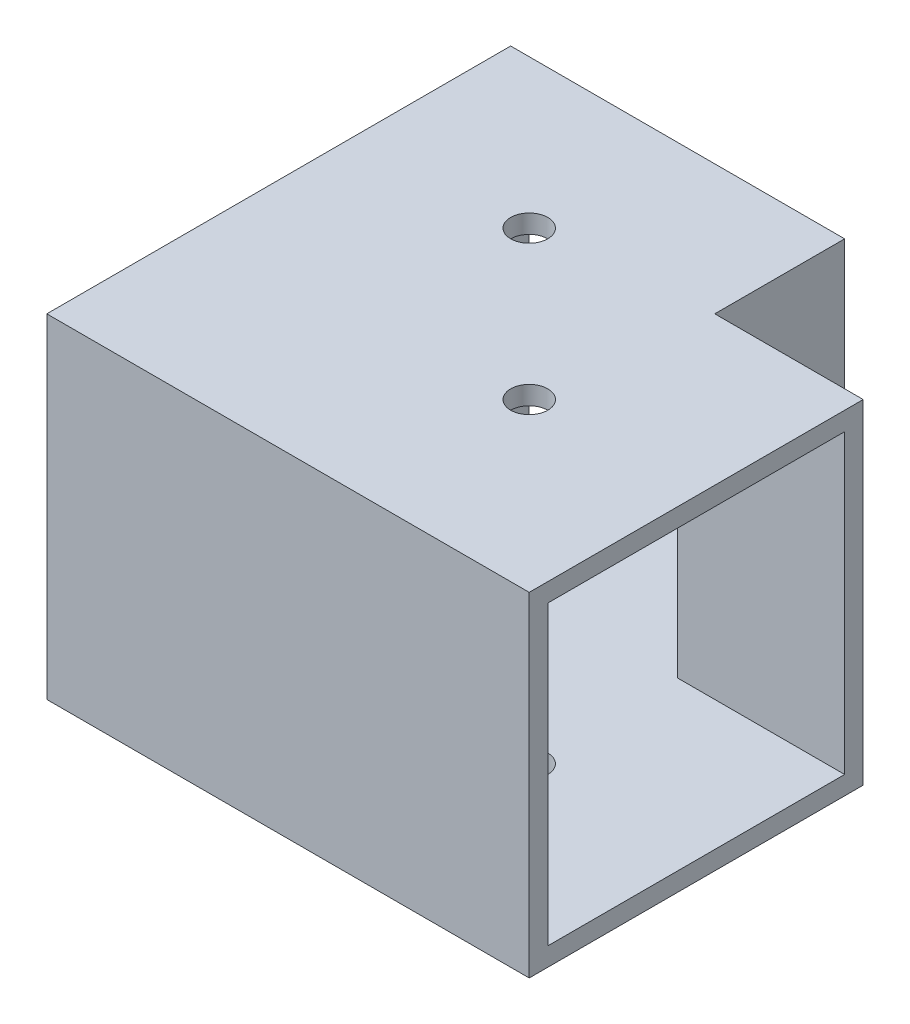
ISO-10303-21;
HEADER;
FILE_DESCRIPTION(('STEP AP214'),'2;1');
FILE_NAME('part.step','',(''),(''),'','','');
FILE_SCHEMA(('AUTOMOTIVE_DESIGN { 1 0 10303 214 1 1 1 1 }'));
ENDSEC;
DATA;
#1=APPLICATION_CONTEXT('core data for automotive mechanical design processes');
#2=APPLICATION_PROTOCOL_DEFINITION('international standard','automotive_design',2000,#1);
#3=PRODUCT_CONTEXT('',#1,'mechanical');
#4=PRODUCT('Part','Part','',(#3));
#5=PRODUCT_RELATED_PRODUCT_CATEGORY('part','',(#4));
#6=PRODUCT_DEFINITION_FORMATION('','',#4);
#7=PRODUCT_DEFINITION_CONTEXT('part definition',#1,'design');
#8=PRODUCT_DEFINITION('design','',#6,#7);
#9=PRODUCT_DEFINITION_SHAPE('','',#8);
#10=(LENGTH_UNIT() NAMED_UNIT(*) SI_UNIT(.MILLI.,.METRE.));
#11=(NAMED_UNIT(*) PLANE_ANGLE_UNIT() SI_UNIT($,.RADIAN.));
#12=(NAMED_UNIT(*) SI_UNIT($,.STERADIAN.) SOLID_ANGLE_UNIT());
#13=UNCERTAINTY_MEASURE_WITH_UNIT(LENGTH_MEASURE(1.E-05),#10,'distance_accuracy_value','');
#14=(GEOMETRIC_REPRESENTATION_CONTEXT(3) GLOBAL_UNCERTAINTY_ASSIGNED_CONTEXT((#13)) GLOBAL_UNIT_ASSIGNED_CONTEXT((#10,
#11,#12)) REPRESENTATION_CONTEXT('',''));
#15=CARTESIAN_POINT('',(0.,0.,0.));
#16=DIRECTION('',(0.,0.,1.));
#17=DIRECTION('',(1.,0.,0.));
#18=AXIS2_PLACEMENT_3D('',#15,#16,#17);
#19=CARTESIAN_POINT('',(-50.8,50.8,50.8));
#20=DIRECTION('',(0.,-1.,0.));
#21=DIRECTION('',(0.,0.,-1.));
#22=AXIS2_PLACEMENT_3D('',#19,#20,#21);
#23=PLANE('',#22);
#24=CARTESIAN_POINT('',(50.8,50.8,101.6));
#25=DIRECTION('',(0.,-1.,0.));
#26=DIRECTION('',(0.,0.,-1.));
#27=AXIS2_PLACEMENT_3D('',#24,#25,#26);
#28=CIRCLE('',#27,6.35);
#29=CARTESIAN_POINT('',(50.8,50.8,107.95));
#30=VERTEX_POINT('',#29);
#31=EDGE_CURVE('E590',#30,#30,#28,.F.);
#32=ORIENTED_EDGE('',*,*,#31,.T.);
#33=EDGE_LOOP('',(#32));
#34=FACE_BOUND('',#33,.T.);
#35=CARTESIAN_POINT('',(0.,50.8,50.8));
#36=DIRECTION('',(0.,-1.,0.));
#37=DIRECTION('',(0.,0.,-1.));
#38=AXIS2_PLACEMENT_3D('',#35,#36,#37);
#39=CIRCLE('',#38,6.35);
#40=CARTESIAN_POINT('',(0.,50.8,57.15));
#41=VERTEX_POINT('',#40);
#42=EDGE_CURVE('E199',#41,#41,#39,.T.);
#43=ORIENTED_EDGE('',*,*,#42,.F.);
#44=EDGE_LOOP('',(#43));
#45=FACE_BOUND('',#44,.T.);
#46=DIRECTION('',(-1.,0.,0.));
#47=VECTOR('',#46,1.);
#48=CARTESIAN_POINT('',(107.95,50.8,152.4));
#49=LINE('',#48,#47);
#50=CARTESIAN_POINT('',(107.95,50.8,152.4));
#51=VERTEX_POINT('',#50);
#52=CARTESIAN_POINT('',(-50.8,50.8,152.4));
#53=VERTEX_POINT('',#52);
#54=EDGE_CURVE('E206',#51,#53,#49,.T.);
#55=ORIENTED_EDGE('',*,*,#54,.T.);
#56=DIRECTION('',(0.,0.,-1.));
#57=VECTOR('',#56,1.);
#58=CARTESIAN_POINT('',(-50.8,50.8,50.8));
#59=LINE('',#58,#57);
#60=CARTESIAN_POINT('',(-50.8,50.8,0.));
#61=VERTEX_POINT('',#60);
#62=EDGE_CURVE('E107',#53,#61,#59,.T.);
#63=ORIENTED_EDGE('',*,*,#62,.T.);
#64=DIRECTION('',(-1.,0.,0.));
#65=VECTOR('',#64,1.);
#66=CARTESIAN_POINT('',(-50.8,50.8,0.));
#67=LINE('',#66,#65);
#68=CARTESIAN_POINT('',(50.8,50.8,0.));
#69=VERTEX_POINT('',#68);
#70=EDGE_CURVE('E258',#69,#61,#67,.T.);
#71=ORIENTED_EDGE('',*,*,#70,.F.);
#72=DIRECTION('',(0.,0.,-1.));
#73=VECTOR('',#72,1.);
#74=CARTESIAN_POINT('',(50.8,50.8,50.8));
#75=LINE('',#74,#73);
#76=CARTESIAN_POINT('',(50.8,50.8,50.8));
#77=VERTEX_POINT('',#76);
#78=EDGE_CURVE('E271',#77,#69,#75,.T.);
#79=ORIENTED_EDGE('',*,*,#78,.F.);
#80=DIRECTION('',(-1.,0.,0.));
#81=VECTOR('',#80,1.);
#82=CARTESIAN_POINT('',(107.95,50.8,50.8));
#83=LINE('',#82,#81);
#84=CARTESIAN_POINT('',(107.95,50.8,50.8));
#85=VERTEX_POINT('',#84);
#86=EDGE_CURVE('E211',#85,#77,#83,.T.);
#87=ORIENTED_EDGE('',*,*,#86,.F.);
#88=DIRECTION('',(0.,0.,1.));
#89=VECTOR('',#88,1.);
#90=CARTESIAN_POINT('',(107.95,50.8,50.8));
#91=LINE('',#90,#89);
#92=EDGE_CURVE('E322',#85,#51,#91,.T.);
#93=ORIENTED_EDGE('',*,*,#92,.T.);
#94=EDGE_LOOP('',(#55,#63,#71,#79,#87,#93));
#95=FACE_BOUND('',#94,.T.);
#96=ADVANCED_FACE('F91',(#34,#45,#95),#23,.T.);
#97=CARTESIAN_POINT('',(-50.8,-50.8,50.8));
#98=DIRECTION('',(0.,1.,0.));
#99=DIRECTION('',(0.,0.,1.));
#100=AXIS2_PLACEMENT_3D('',#97,#98,#99);
#101=PLANE('',#100);
#102=CARTESIAN_POINT('',(50.8,-50.8,101.6));
#103=DIRECTION('',(0.,1.,0.));
#104=DIRECTION('',(0.,0.,1.));
#105=AXIS2_PLACEMENT_3D('',#102,#103,#104);
#106=CIRCLE('',#105,6.35);
#107=CARTESIAN_POINT('',(50.8,-50.8,107.95));
#108=VERTEX_POINT('',#107);
#109=EDGE_CURVE('E601',#108,#108,#106,.F.);
#110=ORIENTED_EDGE('',*,*,#109,.T.);
#111=EDGE_LOOP('',(#110));
#112=FACE_BOUND('',#111,.T.);
#113=CARTESIAN_POINT('',(0.,-50.8,50.8));
#114=DIRECTION('',(0.,1.,0.));
#115=DIRECTION('',(0.,0.,1.));
#116=AXIS2_PLACEMENT_3D('',#113,#114,#115);
#117=CIRCLE('',#116,6.35);
#118=CARTESIAN_POINT('',(0.,-50.8,57.15));
#119=VERTEX_POINT('',#118);
#120=EDGE_CURVE('E582',#119,#119,#117,.T.);
#121=ORIENTED_EDGE('',*,*,#120,.F.);
#122=EDGE_LOOP('',(#121));
#123=FACE_BOUND('',#122,.T.);
#124=DIRECTION('',(0.,0.,-1.));
#125=VECTOR('',#124,1.);
#126=CARTESIAN_POINT('',(-50.8,-50.8,50.8));
#127=LINE('',#126,#125);
#128=CARTESIAN_POINT('',(-50.8,-50.8,152.4));
#129=VERTEX_POINT('',#128);
#130=CARTESIAN_POINT('',(-50.8,-50.8,0.));
#131=VERTEX_POINT('',#130);
#132=EDGE_CURVE('E180',#129,#131,#127,.T.);
#133=ORIENTED_EDGE('',*,*,#132,.F.);
#134=DIRECTION('',(-1.,0.,0.));
#135=VECTOR('',#134,1.);
#136=CARTESIAN_POINT('',(107.95,-50.8,152.4));
#137=LINE('',#136,#135);
#138=CARTESIAN_POINT('',(107.95,-50.8,152.4));
#139=VERTEX_POINT('',#138);
#140=EDGE_CURVE('E183',#139,#129,#137,.T.);
#141=ORIENTED_EDGE('',*,*,#140,.F.);
#142=DIRECTION('',(0.,0.,-1.));
#143=VECTOR('',#142,1.);
#144=CARTESIAN_POINT('',(107.95,-50.8,50.8));
#145=LINE('',#144,#143);
#146=CARTESIAN_POINT('',(107.95,-50.8,50.8));
#147=VERTEX_POINT('',#146);
#148=EDGE_CURVE('E213',#139,#147,#145,.T.);
#149=ORIENTED_EDGE('',*,*,#148,.T.);
#150=DIRECTION('',(-1.,0.,0.));
#151=VECTOR('',#150,1.);
#152=CARTESIAN_POINT('',(107.95,-50.8,50.8));
#153=LINE('',#152,#151);
#154=CARTESIAN_POINT('',(50.8,-50.8,50.8));
#155=VERTEX_POINT('',#154);
#156=EDGE_CURVE('E207',#147,#155,#153,.T.);
#157=ORIENTED_EDGE('',*,*,#156,.T.);
#158=DIRECTION('',(0.,0.,-1.));
#159=VECTOR('',#158,1.);
#160=CARTESIAN_POINT('',(50.8,-50.8,50.8));
#161=LINE('',#160,#159);
#162=CARTESIAN_POINT('',(50.8,-50.8,0.));
#163=VERTEX_POINT('',#162);
#164=EDGE_CURVE('E190',#155,#163,#161,.T.);
#165=ORIENTED_EDGE('',*,*,#164,.T.);
#166=DIRECTION('',(1.,0.,0.));
#167=VECTOR('',#166,1.);
#168=CARTESIAN_POINT('',(-50.8,-50.8,0.));
#169=LINE('',#168,#167);
#170=EDGE_CURVE('E187',#131,#163,#169,.T.);
#171=ORIENTED_EDGE('',*,*,#170,.F.);
#172=EDGE_LOOP('',(#133,#141,#149,#157,#165,#171));
#173=FACE_BOUND('',#172,.T.);
#174=ADVANCED_FACE('F181',(#112,#123,#173),#101,.T.);
#175=CARTESIAN_POINT('',(107.95,-50.8,152.4));
#176=DIRECTION('',(0.,0.,-1.));
#177=DIRECTION('',(-1.,0.,0.));
#178=AXIS2_PLACEMENT_3D('',#175,#176,#177);
#179=PLANE('',#178);
#180=ORIENTED_EDGE('',*,*,#140,.T.);
#181=DIRECTION('',(0.,-1.,0.));
#182=VECTOR('',#181,1.);
#183=CARTESIAN_POINT('',(-50.8,-50.8,152.4));
#184=LINE('',#183,#182);
#185=EDGE_CURVE('E192',#53,#129,#184,.T.);
#186=ORIENTED_EDGE('',*,*,#185,.F.);
#187=ORIENTED_EDGE('',*,*,#54,.F.);
#188=DIRECTION('',(0.,-1.,0.));
#189=VECTOR('',#188,1.);
#190=CARTESIAN_POINT('',(107.95,-50.8,152.4));
#191=LINE('',#190,#189);
#192=EDGE_CURVE('E203',#51,#139,#191,.T.);
#193=ORIENTED_EDGE('',*,*,#192,.T.);
#194=EDGE_LOOP('',(#180,#186,#187,#193));
#195=FACE_BOUND('',#194,.T.);
#196=ADVANCED_FACE('F201',(#195),#179,.T.);
#197=CARTESIAN_POINT('',(0.,0.,50.8));
#198=DIRECTION('',(0.,0.,1.));
#199=DIRECTION('',(1.,0.,0.));
#200=AXIS2_PLACEMENT_3D('',#197,#198,#199);
#201=PLANE('',#200);
#202=ORIENTED_EDGE('',*,*,#86,.T.);
#203=DIRECTION('',(0.,1.,0.));
#204=VECTOR('',#203,1.);
#205=CARTESIAN_POINT('',(50.8,-50.8,50.8));
#206=LINE('',#205,#204);
#207=EDGE_CURVE('E251',#155,#77,#206,.T.);
#208=ORIENTED_EDGE('',*,*,#207,.F.);
#209=ORIENTED_EDGE('',*,*,#156,.F.);
#210=DIRECTION('',(0.,1.,0.));
#211=VECTOR('',#210,1.);
#212=CARTESIAN_POINT('',(107.95,-50.8,50.8));
#213=LINE('',#212,#211);
#214=EDGE_CURVE('E319',#147,#85,#213,.T.);
#215=ORIENTED_EDGE('',*,*,#214,.T.);
#216=EDGE_LOOP('',(#202,#208,#209,#215));
#217=FACE_BOUND('',#216,.T.);
#218=ADVANCED_FACE('F336',(#217),#201,.T.);
#219=CARTESIAN_POINT('',(57.15,0.,50.8));
#220=DIRECTION('',(-1.,0.,0.));
#221=DIRECTION('',(0.,0.,1.));
#222=AXIS2_PLACEMENT_3D('',#219,#220,#221);
#223=PLANE('',#222);
#224=DIRECTION('',(0.,1.,0.));
#225=VECTOR('',#224,1.);
#226=CARTESIAN_POINT('',(57.15,-50.8,44.45));
#227=LINE('',#226,#225);
#228=CARTESIAN_POINT('',(57.15,-57.15,44.45));
#229=VERTEX_POINT('',#228);
#230=CARTESIAN_POINT('',(57.15,57.15,44.45));
#231=VERTEX_POINT('',#230);
#232=EDGE_CURVE('E115',#229,#231,#227,.T.);
#233=ORIENTED_EDGE('',*,*,#232,.F.);
#234=DIRECTION('',(0.,0.,-1.));
#235=VECTOR('',#234,1.);
#236=CARTESIAN_POINT('',(57.15,-57.15,50.8));
#237=LINE('',#236,#235);
#238=CARTESIAN_POINT('',(57.15,-57.15,0.));
#239=VERTEX_POINT('',#238);
#240=EDGE_CURVE('E289',#229,#239,#237,.T.);
#241=ORIENTED_EDGE('',*,*,#240,.T.);
#242=DIRECTION('',(0.,1.,0.));
#243=VECTOR('',#242,1.);
#244=CARTESIAN_POINT('',(57.15,0.,0.));
#245=LINE('',#244,#243);
#246=CARTESIAN_POINT('',(57.15,57.15,0.));
#247=VERTEX_POINT('',#246);
#248=EDGE_CURVE('E275',#239,#247,#245,.T.);
#249=ORIENTED_EDGE('',*,*,#248,.T.);
#250=DIRECTION('',(0.,0.,-1.));
#251=VECTOR('',#250,1.);
#252=CARTESIAN_POINT('',(57.15,57.15,50.8));
#253=LINE('',#252,#251);
#254=EDGE_CURVE('E12',#231,#247,#253,.T.);
#255=ORIENTED_EDGE('',*,*,#254,.F.);
#256=EDGE_LOOP('',(#233,#241,#249,#255));
#257=FACE_BOUND('',#256,.T.);
#258=ADVANCED_FACE('F93',(#257),#223,.F.);
#259=CARTESIAN_POINT('',(0.,0.,0.));
#260=DIRECTION('',(0.,0.,1.));
#261=DIRECTION('',(1.,0.,0.));
#262=AXIS2_PLACEMENT_3D('',#259,#260,#261);
#263=PLANE('',#262);
#264=ORIENTED_EDGE('',*,*,#248,.F.);
#265=DIRECTION('',(1.,0.,0.));
#266=VECTOR('',#265,1.);
#267=CARTESIAN_POINT('',(0.,-57.15,0.));
#268=LINE('',#267,#266);
#269=CARTESIAN_POINT('',(-57.15,-57.15,0.));
#270=VERTEX_POINT('',#269);
#271=EDGE_CURVE('E285',#270,#239,#268,.T.);
#272=ORIENTED_EDGE('',*,*,#271,.F.);
#273=DIRECTION('',(0.,-1.,0.));
#274=VECTOR('',#273,1.);
#275=CARTESIAN_POINT('',(-57.15,0.,0.));
#276=LINE('',#275,#274);
#277=CARTESIAN_POINT('',(-57.15,57.15,0.));
#278=VERTEX_POINT('',#277);
#279=EDGE_CURVE('E282',#278,#270,#276,.T.);
#280=ORIENTED_EDGE('',*,*,#279,.F.);
#281=DIRECTION('',(-1.,0.,0.));
#282=VECTOR('',#281,1.);
#283=CARTESIAN_POINT('',(0.,57.15,0.));
#284=LINE('',#283,#282);
#285=EDGE_CURVE('E279',#247,#278,#284,.T.);
#286=ORIENTED_EDGE('',*,*,#285,.F.);
#287=EDGE_LOOP('',(#264,#272,#280,#286));
#288=FACE_BOUND('',#287,.T.);
#289=DIRECTION('',(0.,1.,0.));
#290=VECTOR('',#289,1.);
#291=CARTESIAN_POINT('',(50.8,-50.8,0.));
#292=LINE('',#291,#290);
#293=EDGE_CURVE('E250',#163,#69,#292,.T.);
#294=ORIENTED_EDGE('',*,*,#293,.T.);
#295=ORIENTED_EDGE('',*,*,#70,.T.);
#296=DIRECTION('',(0.,-1.,0.));
#297=VECTOR('',#296,1.);
#298=CARTESIAN_POINT('',(-50.8,-50.8,0.));
#299=LINE('',#298,#297);
#300=EDGE_CURVE('E262',#61,#131,#299,.T.);
#301=ORIENTED_EDGE('',*,*,#300,.T.);
#302=ORIENTED_EDGE('',*,*,#170,.T.);
#303=EDGE_LOOP('',(#294,#295,#301,#302));
#304=FACE_BOUND('',#303,.T.);
#305=ADVANCED_FACE('F308',(#288,#304),#263,.F.);
#306=CARTESIAN_POINT('',(0.,57.15,50.8));
#307=DIRECTION('',(0.,-1.,0.));
#308=DIRECTION('',(0.,0.,-1.));
#309=AXIS2_PLACEMENT_3D('',#306,#307,#308);
#310=PLANE('',#309);
#311=CARTESIAN_POINT('',(50.8,57.15,101.6));
#312=DIRECTION('',(0.,-1.,0.));
#313=DIRECTION('',(-1.,0.,0.));
#314=AXIS2_PLACEMENT_3D('',#311,#312,#313);
#315=CIRCLE('',#314,6.35);
#316=CARTESIAN_POINT('',(50.8,57.15,107.95));
#317=VERTEX_POINT('',#316);
#318=EDGE_CURVE('E605',#317,#317,#315,.T.);
#319=ORIENTED_EDGE('',*,*,#318,.T.);
#320=EDGE_LOOP('',(#319));
#321=FACE_BOUND('',#320,.T.);
#322=CARTESIAN_POINT('',(0.,57.15,50.8));
#323=DIRECTION('',(0.,1.,0.));
#324=DIRECTION('',(0.,0.,1.));
#325=AXIS2_PLACEMENT_3D('',#322,#323,#324);
#326=CIRCLE('',#325,6.35);
#327=CARTESIAN_POINT('',(0.,57.15,57.15));
#328=VERTEX_POINT('',#327);
#329=EDGE_CURVE('E583',#328,#328,#326,.T.);
#330=ORIENTED_EDGE('',*,*,#329,.F.);
#331=EDGE_LOOP('',(#330));
#332=FACE_BOUND('',#331,.T.);
#333=DIRECTION('',(0.,0.,-1.));
#334=VECTOR('',#333,1.);
#335=CARTESIAN_POINT('',(-57.15,57.15,50.8));
#336=LINE('',#335,#334);
#337=CARTESIAN_POINT('',(-57.15,57.15,158.75));
#338=VERTEX_POINT('',#337);
#339=EDGE_CURVE('E100',#338,#278,#336,.T.);
#340=ORIENTED_EDGE('',*,*,#339,.F.);
#341=DIRECTION('',(-1.,0.,0.));
#342=VECTOR('',#341,1.);
#343=CARTESIAN_POINT('',(107.95,57.15,158.75));
#344=LINE('',#343,#342);
#345=CARTESIAN_POINT('',(107.95,57.15,158.75));
#346=VERTEX_POINT('',#345);
#347=EDGE_CURVE('E242',#346,#338,#344,.T.);
#348=ORIENTED_EDGE('',*,*,#347,.F.);
#349=DIRECTION('',(0.,0.,1.));
#350=VECTOR('',#349,1.);
#351=CARTESIAN_POINT('',(107.95,57.15,50.8));
#352=LINE('',#351,#350);
#353=CARTESIAN_POINT('',(107.95,57.15,44.45));
#354=VERTEX_POINT('',#353);
#355=EDGE_CURVE('E223',#354,#346,#352,.T.);
#356=ORIENTED_EDGE('',*,*,#355,.F.);
#357=DIRECTION('',(-1.,0.,0.));
#358=VECTOR('',#357,1.);
#359=CARTESIAN_POINT('',(107.95,57.15,44.45));
#360=LINE('',#359,#358);
#361=EDGE_CURVE('E246',#354,#231,#360,.T.);
#362=ORIENTED_EDGE('',*,*,#361,.T.);
#363=ORIENTED_EDGE('',*,*,#254,.T.);
#364=ORIENTED_EDGE('',*,*,#285,.T.);
#365=EDGE_LOOP('',(#340,#348,#356,#362,#363,#364));
#366=FACE_BOUND('',#365,.T.);
#367=ADVANCED_FACE('F345',(#321,#332,#366),#310,.F.);
#368=CARTESIAN_POINT('',(-57.15,0.,50.8));
#369=DIRECTION('',(1.,0.,0.));
#370=DIRECTION('',(0.,0.,-1.));
#371=AXIS2_PLACEMENT_3D('',#368,#369,#370);
#372=PLANE('',#371);
#373=ORIENTED_EDGE('',*,*,#279,.T.);
#374=DIRECTION('',(0.,0.,-1.));
#375=VECTOR('',#374,1.);
#376=CARTESIAN_POINT('',(-57.15,-57.15,50.8));
#377=LINE('',#376,#375);
#378=CARTESIAN_POINT('',(-57.15,-57.15,158.75));
#379=VERTEX_POINT('',#378);
#380=EDGE_CURVE('E292',#379,#270,#377,.T.);
#381=ORIENTED_EDGE('',*,*,#380,.F.);
#382=DIRECTION('',(0.,-1.,0.));
#383=VECTOR('',#382,1.);
#384=CARTESIAN_POINT('',(-57.15,-57.15,158.75));
#385=LINE('',#384,#383);
#386=EDGE_CURVE('E198',#338,#379,#385,.T.);
#387=ORIENTED_EDGE('',*,*,#386,.F.);
#388=ORIENTED_EDGE('',*,*,#339,.T.);
#389=EDGE_LOOP('',(#373,#381,#387,#388));
#390=FACE_BOUND('',#389,.T.);
#391=ADVANCED_FACE('F300',(#390),#372,.F.);
#392=CARTESIAN_POINT('',(0.,-57.15,50.8));
#393=DIRECTION('',(0.,1.,0.));
#394=DIRECTION('',(0.,0.,1.));
#395=AXIS2_PLACEMENT_3D('',#392,#393,#394);
#396=PLANE('',#395);
#397=CARTESIAN_POINT('',(50.8,-57.15,101.6));
#398=DIRECTION('',(0.,-1.,0.));
#399=DIRECTION('',(-1.,0.,0.));
#400=AXIS2_PLACEMENT_3D('',#397,#398,#399);
#401=CIRCLE('',#400,6.35);
#402=CARTESIAN_POINT('',(50.8,-57.15,107.95));
#403=VERTEX_POINT('',#402);
#404=EDGE_CURVE('E576',#403,#403,#401,.T.);
#405=ORIENTED_EDGE('',*,*,#404,.F.);
#406=EDGE_LOOP('',(#405));
#407=FACE_BOUND('',#406,.T.);
#408=CARTESIAN_POINT('',(0.,-57.15,50.8));
#409=DIRECTION('',(0.,1.,0.));
#410=DIRECTION('',(0.,0.,1.));
#411=AXIS2_PLACEMENT_3D('',#408,#409,#410);
#412=CIRCLE('',#411,6.35);
#413=CARTESIAN_POINT('',(0.,-57.15,57.15));
#414=VERTEX_POINT('',#413);
#415=EDGE_CURVE('E579',#414,#414,#412,.T.);
#416=ORIENTED_EDGE('',*,*,#415,.T.);
#417=EDGE_LOOP('',(#416));
#418=FACE_BOUND('',#417,.T.);
#419=ORIENTED_EDGE('',*,*,#271,.T.);
#420=ORIENTED_EDGE('',*,*,#240,.F.);
#421=DIRECTION('',(-1.,0.,0.));
#422=VECTOR('',#421,1.);
#423=CARTESIAN_POINT('',(107.95,-57.15,44.45));
#424=LINE('',#423,#422);
#425=CARTESIAN_POINT('',(107.95,-57.15,44.45));
#426=VERTEX_POINT('',#425);
#427=EDGE_CURVE('E232',#426,#229,#424,.T.);
#428=ORIENTED_EDGE('',*,*,#427,.F.);
#429=DIRECTION('',(0.,0.,-1.));
#430=VECTOR('',#429,1.);
#431=CARTESIAN_POINT('',(107.95,-57.15,50.8));
#432=LINE('',#431,#430);
#433=CARTESIAN_POINT('',(107.95,-57.15,158.75));
#434=VERTEX_POINT('',#433);
#435=EDGE_CURVE('E229',#434,#426,#432,.T.);
#436=ORIENTED_EDGE('',*,*,#435,.F.);
#437=DIRECTION('',(-1.,0.,0.));
#438=VECTOR('',#437,1.);
#439=CARTESIAN_POINT('',(107.95,-57.15,158.75));
#440=LINE('',#439,#438);
#441=EDGE_CURVE('E238',#434,#379,#440,.T.);
#442=ORIENTED_EDGE('',*,*,#441,.T.);
#443=ORIENTED_EDGE('',*,*,#380,.T.);
#444=EDGE_LOOP('',(#419,#420,#428,#436,#442,#443));
#445=FACE_BOUND('',#444,.T.);
#446=ADVANCED_FACE('F311',(#407,#418,#445),#396,.F.);
#447=CARTESIAN_POINT('',(50.8,-50.8,50.8));
#448=DIRECTION('',(-1.,0.,0.));
#449=DIRECTION('',(0.,0.,1.));
#450=AXIS2_PLACEMENT_3D('',#447,#448,#449);
#451=PLANE('',#450);
#452=ORIENTED_EDGE('',*,*,#293,.F.);
#453=ORIENTED_EDGE('',*,*,#164,.F.);
#454=ORIENTED_EDGE('',*,*,#207,.T.);
#455=ORIENTED_EDGE('',*,*,#78,.T.);
#456=EDGE_LOOP('',(#452,#453,#454,#455));
#457=FACE_BOUND('',#456,.T.);
#458=ADVANCED_FACE('F343',(#457),#451,.T.);
#459=CARTESIAN_POINT('',(-50.8,-50.8,50.8));
#460=DIRECTION('',(1.,0.,0.));
#461=DIRECTION('',(0.,0.,-1.));
#462=AXIS2_PLACEMENT_3D('',#459,#460,#461);
#463=PLANE('',#462);
#464=ORIENTED_EDGE('',*,*,#300,.F.);
#465=ORIENTED_EDGE('',*,*,#62,.F.);
#466=ORIENTED_EDGE('',*,*,#185,.T.);
#467=ORIENTED_EDGE('',*,*,#132,.T.);
#468=EDGE_LOOP('',(#464,#465,#466,#467));
#469=FACE_BOUND('',#468,.T.);
#470=ADVANCED_FACE('F193',(#469),#463,.T.);
#471=CARTESIAN_POINT('',(107.95,0.,0.));
#472=DIRECTION('',(1.,0.,0.));
#473=DIRECTION('',(0.,0.,-1.));
#474=AXIS2_PLACEMENT_3D('',#471,#472,#473);
#475=PLANE('',#474);
#476=DIRECTION('',(0.,1.,0.));
#477=VECTOR('',#476,1.);
#478=CARTESIAN_POINT('',(107.95,-50.8,44.45));
#479=LINE('',#478,#477);
#480=EDGE_CURVE('E219',#426,#354,#479,.T.);
#481=ORIENTED_EDGE('',*,*,#480,.T.);
#482=ORIENTED_EDGE('',*,*,#355,.T.);
#483=DIRECTION('',(0.,-1.,0.));
#484=VECTOR('',#483,1.);
#485=CARTESIAN_POINT('',(107.95,-50.8,158.75));
#486=LINE('',#485,#484);
#487=EDGE_CURVE('E226',#346,#434,#486,.T.);
#488=ORIENTED_EDGE('',*,*,#487,.T.);
#489=ORIENTED_EDGE('',*,*,#435,.T.);
#490=EDGE_LOOP('',(#481,#482,#488,#489));
#491=FACE_BOUND('',#490,.T.);
#492=ORIENTED_EDGE('',*,*,#92,.F.);
#493=ORIENTED_EDGE('',*,*,#214,.F.);
#494=ORIENTED_EDGE('',*,*,#148,.F.);
#495=ORIENTED_EDGE('',*,*,#192,.F.);
#496=EDGE_LOOP('',(#492,#493,#494,#495));
#497=FACE_BOUND('',#496,.T.);
#498=ADVANCED_FACE('F339',(#491,#497),#475,.T.);
#499=CARTESIAN_POINT('',(107.95,-50.8,44.45));
#500=DIRECTION('',(0.,0.,1.));
#501=DIRECTION('',(1.,0.,0.));
#502=AXIS2_PLACEMENT_3D('',#499,#500,#501);
#503=PLANE('',#502);
#504=ORIENTED_EDGE('',*,*,#232,.T.);
#505=ORIENTED_EDGE('',*,*,#361,.F.);
#506=ORIENTED_EDGE('',*,*,#480,.F.);
#507=ORIENTED_EDGE('',*,*,#427,.T.);
#508=EDGE_LOOP('',(#504,#505,#506,#507));
#509=FACE_BOUND('',#508,.T.);
#510=ADVANCED_FACE('F380',(#509),#503,.F.);
#511=CARTESIAN_POINT('',(107.95,-50.8,158.75));
#512=DIRECTION('',(0.,0.,-1.));
#513=DIRECTION('',(-1.,0.,0.));
#514=AXIS2_PLACEMENT_3D('',#511,#512,#513);
#515=PLANE('',#514);
#516=ORIENTED_EDGE('',*,*,#347,.T.);
#517=ORIENTED_EDGE('',*,*,#386,.T.);
#518=ORIENTED_EDGE('',*,*,#441,.F.);
#519=ORIENTED_EDGE('',*,*,#487,.F.);
#520=EDGE_LOOP('',(#516,#517,#518,#519));
#521=FACE_BOUND('',#520,.T.);
#522=ADVANCED_FACE('F317',(#521),#515,.F.);
#523=CARTESIAN_POINT('',(0.,-57.15,50.8));
#524=DIRECTION('',(0.,1.,0.));
#525=DIRECTION('',(0.,0.,1.));
#526=AXIS2_PLACEMENT_3D('',#523,#524,#525);
#527=CYLINDRICAL_SURFACE('',#526,6.35);
#528=CARTESIAN_POINT('',(0.,-50.8,57.15));
#529=CARTESIAN_POINT('',(0.,-50.8661458333333,57.15));
#530=CARTESIAN_POINT('',(0.,-50.9322916666667,57.15));
#531=CARTESIAN_POINT('',(0.,-51.0645833333333,57.15));
#532=CARTESIAN_POINT('',(0.,-51.1307291666667,57.15));
#533=CARTESIAN_POINT('',(0.,-51.2630208333333,57.15));
#534=CARTESIAN_POINT('',(0.,-51.3291666666667,57.15));
#535=CARTESIAN_POINT('',(0.,-51.4614583333333,57.15));
#536=CARTESIAN_POINT('',(0.,-51.5276041666667,57.15));
#537=CARTESIAN_POINT('',(0.,-51.6598958333333,57.15));
#538=CARTESIAN_POINT('',(0.,-51.7260416666667,57.15));
#539=CARTESIAN_POINT('',(0.,-51.8583333333333,57.15));
#540=CARTESIAN_POINT('',(0.,-51.9244791666667,57.15));
#541=CARTESIAN_POINT('',(0.,-52.0567708333333,57.15));
#542=CARTESIAN_POINT('',(0.,-52.1229166666667,57.15));
#543=CARTESIAN_POINT('',(0.,-52.2552083333333,57.15));
#544=CARTESIAN_POINT('',(0.,-52.3213541666667,57.15));
#545=CARTESIAN_POINT('',(0.,-52.4536458333333,57.15));
#546=CARTESIAN_POINT('',(0.,-52.5197916666667,57.15));
#547=CARTESIAN_POINT('',(0.,-52.6520833333333,57.15));
#548=CARTESIAN_POINT('',(0.,-52.7182291666667,57.15));
#549=CARTESIAN_POINT('',(0.,-52.8505208333333,57.15));
#550=CARTESIAN_POINT('',(0.,-52.9166666666667,57.15));
#551=CARTESIAN_POINT('',(0.,-53.0489583333333,57.15));
#552=CARTESIAN_POINT('',(0.,-53.1151041666667,57.15));
#553=CARTESIAN_POINT('',(0.,-53.2473958333333,57.15));
#554=CARTESIAN_POINT('',(0.,-53.3135416666667,57.15));
#555=CARTESIAN_POINT('',(0.,-53.4458333333333,57.15));
#556=CARTESIAN_POINT('',(0.,-53.5119791666667,57.15));
#557=CARTESIAN_POINT('',(0.,-53.6442708333333,57.15));
#558=CARTESIAN_POINT('',(0.,-53.7104166666667,57.15));
#559=CARTESIAN_POINT('',(0.,-53.8427083333333,57.15));
#560=CARTESIAN_POINT('',(0.,-53.9088541666667,57.15));
#561=CARTESIAN_POINT('',(0.,-54.0411458333333,57.15));
#562=CARTESIAN_POINT('',(0.,-54.1072916666667,57.15));
#563=CARTESIAN_POINT('',(0.,-54.2395833333333,57.15));
#564=CARTESIAN_POINT('',(0.,-54.3057291666667,57.15));
#565=CARTESIAN_POINT('',(0.,-54.4380208333333,57.15));
#566=CARTESIAN_POINT('',(0.,-54.5041666666667,57.15));
#567=CARTESIAN_POINT('',(0.,-54.6364583333333,57.15));
#568=CARTESIAN_POINT('',(0.,-54.7026041666667,57.15));
#569=CARTESIAN_POINT('',(0.,-54.8348958333333,57.15));
#570=CARTESIAN_POINT('',(0.,-54.9010416666667,57.15));
#571=CARTESIAN_POINT('',(0.,-55.0333333333333,57.15));
#572=CARTESIAN_POINT('',(0.,-55.0994791666667,57.15));
#573=CARTESIAN_POINT('',(0.,-55.2317708333333,57.15));
#574=CARTESIAN_POINT('',(0.,-55.2979166666667,57.15));
#575=CARTESIAN_POINT('',(0.,-55.4302083333333,57.15));
#576=CARTESIAN_POINT('',(0.,-55.4963541666667,57.15));
#577=CARTESIAN_POINT('',(0.,-55.6286458333334,57.15));
#578=CARTESIAN_POINT('',(0.,-55.6947916666667,57.15));
#579=CARTESIAN_POINT('',(0.,-55.8270833333333,57.15));
#580=CARTESIAN_POINT('',(0.,-55.8932291666667,57.15));
#581=CARTESIAN_POINT('',(0.,-56.0255208333333,57.15));
#582=CARTESIAN_POINT('',(0.,-56.0916666666667,57.15));
#583=CARTESIAN_POINT('',(0.,-56.2239583333333,57.15));
#584=CARTESIAN_POINT('',(0.,-56.2901041666667,57.15));
#585=CARTESIAN_POINT('',(0.,-56.4223958333333,57.15));
#586=CARTESIAN_POINT('',(0.,-56.4885416666667,57.15));
#587=CARTESIAN_POINT('',(0.,-56.6208333333334,57.15));
#588=CARTESIAN_POINT('',(0.,-56.6869791666667,57.15));
#589=CARTESIAN_POINT('',(0.,-56.8192708333333,57.15));
#590=CARTESIAN_POINT('',(0.,-56.8854166666667,57.15));
#591=CARTESIAN_POINT('',(0.,-57.0177083333333,57.15));
#592=CARTESIAN_POINT('',(0.,-57.0838541666667,57.15));
#593=CARTESIAN_POINT('',(0.,-57.15,57.15));
#594=B_SPLINE_CURVE_WITH_KNOTS('',3,(#528,#529,#530,#531,#532,#533,#534,#535,#536,#537,#538,
#539,#540,#541,#542,#543,#544,#545,#546,#547,#548,#549,#550,#551,#552,#553,#554,#555,#556,#557,
#558,#559,#560,#561,#562,#563,#564,#565,#566,#567,#568,#569,#570,#571,#572,#573,#574,#575,#576,
#577,#578,#579,#580,#581,#582,#583,#584,#585,#586,#587,#588,#589,#590,#591,#592,#593),
.UNSPECIFIED.,.F.,.F.,(4,2,2,2,2,2,2,2,2,2,2,2,2,2,2,2,2,2,2,2,2,2,2,2,2,2,2,2,2,2,2,2,4),(0.,
0.198437499999995,0.396874999999998,0.5953125,0.793750000000003,0.992187499999998,1.190625,
1.3890625,1.5875,1.7859375,1.984375,2.1828125,2.38125,2.5796875,2.77812500000001,2.9765625,
3.175,3.37343750000001,3.57187500000001,3.7703125,3.96875000000001,4.16718750000001,4.365625,
4.56406250000001,4.76250000000001,4.96093750000001,5.15937500000001,5.35781250000001,
5.55625000000001,5.75468750000001,5.95312500000001,6.15156250000001,6.35000000000001),.UNSPECIFIED.);
#595=EDGE_CURVE('BSEAM376',#119,#414,#594,.T.);
#596=ORIENTED_EDGE('',*,*,#120,.T.);
#597=ORIENTED_EDGE('',*,*,#415,.F.);
#598=ORIENTED_EDGE('',*,*,#595,.T.);
#599=ORIENTED_EDGE('',*,*,#595,.F.);
#600=EDGE_LOOP('',(#596,#598,#597,#599));
#601=FACE_BOUND('',#600,.T.);
#602=ADVANCED_FACE('F376',(#601),#527,.F.);
#603=CARTESIAN_POINT('',(0.,50.8,57.15));
#604=CARTESIAN_POINT('',(0.,50.8661458333333,57.15));
#605=CARTESIAN_POINT('',(0.,50.9322916666667,57.15));
#606=CARTESIAN_POINT('',(0.,51.0645833333333,57.15));
#607=CARTESIAN_POINT('',(0.,51.1307291666667,57.15));
#608=CARTESIAN_POINT('',(0.,51.2630208333333,57.15));
#609=CARTESIAN_POINT('',(0.,51.3291666666667,57.15));
#610=CARTESIAN_POINT('',(0.,51.4614583333333,57.15));
#611=CARTESIAN_POINT('',(0.,51.5276041666667,57.15));
#612=CARTESIAN_POINT('',(0.,51.6598958333333,57.15));
#613=CARTESIAN_POINT('',(0.,51.7260416666667,57.15));
#614=CARTESIAN_POINT('',(0.,51.8583333333333,57.15));
#615=CARTESIAN_POINT('',(0.,51.9244791666667,57.15));
#616=CARTESIAN_POINT('',(0.,52.0567708333333,57.15));
#617=CARTESIAN_POINT('',(0.,52.1229166666667,57.15));
#618=CARTESIAN_POINT('',(0.,52.2552083333333,57.15));
#619=CARTESIAN_POINT('',(0.,52.3213541666667,57.15));
#620=CARTESIAN_POINT('',(0.,52.4536458333333,57.15));
#621=CARTESIAN_POINT('',(0.,52.5197916666667,57.15));
#622=CARTESIAN_POINT('',(0.,52.6520833333333,57.15));
#623=CARTESIAN_POINT('',(0.,52.7182291666667,57.15));
#624=CARTESIAN_POINT('',(0.,52.8505208333333,57.15));
#625=CARTESIAN_POINT('',(0.,52.9166666666667,57.15));
#626=CARTESIAN_POINT('',(0.,53.0489583333333,57.15));
#627=CARTESIAN_POINT('',(0.,53.1151041666667,57.15));
#628=CARTESIAN_POINT('',(0.,53.2473958333333,57.15));
#629=CARTESIAN_POINT('',(0.,53.3135416666667,57.15));
#630=CARTESIAN_POINT('',(0.,53.4458333333333,57.15));
#631=CARTESIAN_POINT('',(0.,53.5119791666667,57.15));
#632=CARTESIAN_POINT('',(0.,53.6442708333333,57.15));
#633=CARTESIAN_POINT('',(0.,53.7104166666667,57.15));
#634=CARTESIAN_POINT('',(0.,53.8427083333333,57.15));
#635=CARTESIAN_POINT('',(0.,53.9088541666667,57.15));
#636=CARTESIAN_POINT('',(0.,54.0411458333333,57.15));
#637=CARTESIAN_POINT('',(0.,54.1072916666667,57.15));
#638=CARTESIAN_POINT('',(0.,54.2395833333333,57.15));
#639=CARTESIAN_POINT('',(0.,54.3057291666667,57.15));
#640=CARTESIAN_POINT('',(0.,54.4380208333333,57.15));
#641=CARTESIAN_POINT('',(0.,54.5041666666667,57.15));
#642=CARTESIAN_POINT('',(0.,54.6364583333333,57.15));
#643=CARTESIAN_POINT('',(0.,54.7026041666667,57.15));
#644=CARTESIAN_POINT('',(0.,54.8348958333333,57.15));
#645=CARTESIAN_POINT('',(0.,54.9010416666667,57.15));
#646=CARTESIAN_POINT('',(0.,55.0333333333333,57.15));
#647=CARTESIAN_POINT('',(0.,55.0994791666667,57.15));
#648=CARTESIAN_POINT('',(0.,55.2317708333333,57.15));
#649=CARTESIAN_POINT('',(0.,55.2979166666667,57.15));
#650=CARTESIAN_POINT('',(0.,55.4302083333333,57.15));
#651=CARTESIAN_POINT('',(0.,55.4963541666667,57.15));
#652=CARTESIAN_POINT('',(0.,55.6286458333333,57.15));
#653=CARTESIAN_POINT('',(0.,55.6947916666667,57.15));
#654=CARTESIAN_POINT('',(0.,55.8270833333333,57.15));
#655=CARTESIAN_POINT('',(0.,55.8932291666667,57.15));
#656=CARTESIAN_POINT('',(0.,56.0255208333333,57.15));
#657=CARTESIAN_POINT('',(0.,56.0916666666667,57.15));
#658=CARTESIAN_POINT('',(0.,56.2239583333333,57.15));
#659=CARTESIAN_POINT('',(0.,56.2901041666667,57.15));
#660=CARTESIAN_POINT('',(0.,56.4223958333333,57.15));
#661=CARTESIAN_POINT('',(0.,56.4885416666667,57.15));
#662=CARTESIAN_POINT('',(0.,56.6208333333333,57.15));
#663=CARTESIAN_POINT('',(0.,56.6869791666667,57.15));
#664=CARTESIAN_POINT('',(0.,56.8192708333333,57.15));
#665=CARTESIAN_POINT('',(0.,56.8854166666667,57.15));
#666=CARTESIAN_POINT('',(0.,57.0177083333333,57.15));
#667=CARTESIAN_POINT('',(0.,57.0838541666667,57.15));
#668=CARTESIAN_POINT('',(0.,57.15,57.15));
#669=B_SPLINE_CURVE_WITH_KNOTS('',3,(#603,#604,#605,#606,#607,#608,#609,#610,#611,#612,#613,
#614,#615,#616,#617,#618,#619,#620,#621,#622,#623,#624,#625,#626,#627,#628,#629,#630,#631,#632,
#633,#634,#635,#636,#637,#638,#639,#640,#641,#642,#643,#644,#645,#646,#647,#648,#649,#650,#651,
#652,#653,#654,#655,#656,#657,#658,#659,#660,#661,#662,#663,#664,#665,#666,#667,#668),
.UNSPECIFIED.,.F.,.F.,(4,2,2,2,2,2,2,2,2,2,2,2,2,2,2,2,2,2,2,2,2,2,2,2,2,2,2,2,2,2,2,2,4),(0.,
0.198437499999995,0.396874999999991,0.5953125,0.793749999999996,0.992187499999991,1.190625,
1.3890625,1.58749999999999,1.78593749999999,1.98437499999998,2.18281249999999,2.38124999999999,
2.57968749999998,2.77812499999999,2.97656249999999,3.17499999999998,3.37343749999998,
3.57187499999997,3.77031249999998,3.96874999999998,4.16718749999997,4.36562499999998,
4.56406249999998,4.76249999999998,4.96093749999997,5.15937499999997,5.35781249999998,
5.55624999999997,5.75468749999997,5.95312499999998,6.15156249999997,6.34999999999997),.UNSPECIFIED.);
#670=EDGE_CURVE('BSEAM404',#41,#328,#669,.T.);
#671=ORIENTED_EDGE('',*,*,#42,.T.);
#672=ORIENTED_EDGE('',*,*,#329,.T.);
#673=ORIENTED_EDGE('',*,*,#670,.T.);
#674=ORIENTED_EDGE('',*,*,#670,.F.);
#675=EDGE_LOOP('',(#671,#673,#672,#674));
#676=FACE_BOUND('',#675,.T.);
#677=ADVANCED_FACE('F404',(#676),#527,.F.);
#678=CARTESIAN_POINT('',(50.8,-57.15,101.6));
#679=DIRECTION('',(0.,1.,0.));
#680=DIRECTION('',(0.,0.,1.));
#681=AXIS2_PLACEMENT_3D('',#678,#679,#680);
#682=CYLINDRICAL_SURFACE('',#681,6.35);
#683=CARTESIAN_POINT('',(50.8,-50.8,107.95));
#684=CARTESIAN_POINT('',(50.8,-50.8661458333333,107.95));
#685=CARTESIAN_POINT('',(50.8,-50.9322916666667,107.95));
#686=CARTESIAN_POINT('',(50.8,-51.0645833333333,107.95));
#687=CARTESIAN_POINT('',(50.8,-51.1307291666667,107.95));
#688=CARTESIAN_POINT('',(50.8,-51.2630208333333,107.95));
#689=CARTESIAN_POINT('',(50.8,-51.3291666666667,107.95));
#690=CARTESIAN_POINT('',(50.8,-51.4614583333333,107.95));
#691=CARTESIAN_POINT('',(50.8,-51.5276041666667,107.95));
#692=CARTESIAN_POINT('',(50.8,-51.6598958333333,107.95));
#693=CARTESIAN_POINT('',(50.8,-51.7260416666667,107.95));
#694=CARTESIAN_POINT('',(50.8,-51.8583333333333,107.95));
#695=CARTESIAN_POINT('',(50.8,-51.9244791666667,107.95));
#696=CARTESIAN_POINT('',(50.8,-52.0567708333333,107.95));
#697=CARTESIAN_POINT('',(50.8,-52.1229166666667,107.95));
#698=CARTESIAN_POINT('',(50.8,-52.2552083333333,107.95));
#699=CARTESIAN_POINT('',(50.8,-52.3213541666667,107.95));
#700=CARTESIAN_POINT('',(50.8,-52.4536458333333,107.95));
#701=CARTESIAN_POINT('',(50.8,-52.5197916666667,107.95));
#702=CARTESIAN_POINT('',(50.8,-52.6520833333333,107.95));
#703=CARTESIAN_POINT('',(50.8,-52.7182291666667,107.95));
#704=CARTESIAN_POINT('',(50.8,-52.8505208333333,107.95));
#705=CARTESIAN_POINT('',(50.8,-52.9166666666667,107.95));
#706=CARTESIAN_POINT('',(50.8,-53.0489583333333,107.95));
#707=CARTESIAN_POINT('',(50.8,-53.1151041666667,107.95));
#708=CARTESIAN_POINT('',(50.8,-53.2473958333333,107.95));
#709=CARTESIAN_POINT('',(50.8,-53.3135416666667,107.95));
#710=CARTESIAN_POINT('',(50.8,-53.4458333333333,107.95));
#711=CARTESIAN_POINT('',(50.8,-53.5119791666667,107.95));
#712=CARTESIAN_POINT('',(50.8,-53.6442708333333,107.95));
#713=CARTESIAN_POINT('',(50.8,-53.7104166666667,107.95));
#714=CARTESIAN_POINT('',(50.8,-53.8427083333333,107.95));
#715=CARTESIAN_POINT('',(50.8,-53.9088541666667,107.95));
#716=CARTESIAN_POINT('',(50.8,-54.0411458333333,107.95));
#717=CARTESIAN_POINT('',(50.8,-54.1072916666667,107.95));
#718=CARTESIAN_POINT('',(50.8,-54.2395833333333,107.95));
#719=CARTESIAN_POINT('',(50.8,-54.3057291666667,107.95));
#720=CARTESIAN_POINT('',(50.8,-54.4380208333333,107.95));
#721=CARTESIAN_POINT('',(50.8,-54.5041666666667,107.95));
#722=CARTESIAN_POINT('',(50.8,-54.6364583333333,107.95));
#723=CARTESIAN_POINT('',(50.8,-54.7026041666667,107.95));
#724=CARTESIAN_POINT('',(50.8,-54.8348958333333,107.95));
#725=CARTESIAN_POINT('',(50.8,-54.9010416666667,107.95));
#726=CARTESIAN_POINT('',(50.8,-55.0333333333333,107.95));
#727=CARTESIAN_POINT('',(50.8,-55.0994791666667,107.95));
#728=CARTESIAN_POINT('',(50.8,-55.2317708333333,107.95));
#729=CARTESIAN_POINT('',(50.8,-55.2979166666667,107.95));
#730=CARTESIAN_POINT('',(50.8,-55.4302083333333,107.95));
#731=CARTESIAN_POINT('',(50.8,-55.4963541666667,107.95));
#732=CARTESIAN_POINT('',(50.8,-55.6286458333333,107.95));
#733=CARTESIAN_POINT('',(50.8,-55.6947916666667,107.95));
#734=CARTESIAN_POINT('',(50.8,-55.8270833333333,107.95));
#735=CARTESIAN_POINT('',(50.8,-55.8932291666667,107.95));
#736=CARTESIAN_POINT('',(50.8,-56.0255208333333,107.95));
#737=CARTESIAN_POINT('',(50.8,-56.0916666666667,107.95));
#738=CARTESIAN_POINT('',(50.8,-56.2239583333333,107.95));
#739=CARTESIAN_POINT('',(50.8,-56.2901041666667,107.95));
#740=CARTESIAN_POINT('',(50.8,-56.4223958333333,107.95));
#741=CARTESIAN_POINT('',(50.8,-56.4885416666667,107.95));
#742=CARTESIAN_POINT('',(50.8,-56.6208333333333,107.95));
#743=CARTESIAN_POINT('',(50.8,-56.6869791666667,107.95));
#744=CARTESIAN_POINT('',(50.8,-56.8192708333333,107.95));
#745=CARTESIAN_POINT('',(50.8,-56.8854166666667,107.95));
#746=CARTESIAN_POINT('',(50.8,-57.0177083333333,107.95));
#747=CARTESIAN_POINT('',(50.8,-57.0838541666667,107.95));
#748=CARTESIAN_POINT('',(50.8,-57.15,107.95));
#749=B_SPLINE_CURVE_WITH_KNOTS('',3,(#683,#684,#685,#686,#687,#688,#689,#690,#691,#692,#693,
#694,#695,#696,#697,#698,#699,#700,#701,#702,#703,#704,#705,#706,#707,#708,#709,#710,#711,#712,
#713,#714,#715,#716,#717,#718,#719,#720,#721,#722,#723,#724,#725,#726,#727,#728,#729,#730,#731,
#732,#733,#734,#735,#736,#737,#738,#739,#740,#741,#742,#743,#744,#745,#746,#747,#748),
.UNSPECIFIED.,.F.,.F.,(4,2,2,2,2,2,2,2,2,2,2,2,2,2,2,2,2,2,2,2,2,2,2,2,2,2,2,2,2,2,2,2,4),(0.,
0.198437499999995,0.396874999999998,0.5953125,0.793749999999996,0.992187499999998,1.190625,
1.3890625,1.5875,1.7859375,1.984375,2.1828125,2.38125,2.5796875,2.778125,2.9765625,3.175,
3.3734375,3.571875,3.7703125,3.96875,4.1671875,4.365625,4.5640625,4.7625,4.96093750000001,
5.159375,5.3578125,5.55625000000001,5.75468750000001,5.953125,6.15156250000001,
6.35000000000001),.UNSPECIFIED.);
#750=EDGE_CURVE('BSEAM412',#108,#403,#749,.T.);
#751=ORIENTED_EDGE('',*,*,#109,.F.);
#752=ORIENTED_EDGE('',*,*,#404,.T.);
#753=ORIENTED_EDGE('',*,*,#750,.T.);
#754=ORIENTED_EDGE('',*,*,#750,.F.);
#755=EDGE_LOOP('',(#751,#753,#752,#754));
#756=FACE_BOUND('',#755,.T.);
#757=ADVANCED_FACE('F412',(#756),#682,.F.);
#758=CARTESIAN_POINT('',(50.8,50.8,107.95));
#759=CARTESIAN_POINT('',(50.8,50.8661458333333,107.95));
#760=CARTESIAN_POINT('',(50.8,50.9322916666667,107.95));
#761=CARTESIAN_POINT('',(50.8,51.0645833333334,107.95));
#762=CARTESIAN_POINT('',(50.8,51.1307291666667,107.95));
#763=CARTESIAN_POINT('',(50.8,51.2630208333333,107.95));
#764=CARTESIAN_POINT('',(50.8,51.3291666666667,107.95));
#765=CARTESIAN_POINT('',(50.8,51.4614583333333,107.95));
#766=CARTESIAN_POINT('',(50.8,51.5276041666667,107.95));
#767=CARTESIAN_POINT('',(50.8,51.6598958333334,107.95));
#768=CARTESIAN_POINT('',(50.8,51.7260416666667,107.95));
#769=CARTESIAN_POINT('',(50.8,51.8583333333334,107.95));
#770=CARTESIAN_POINT('',(50.8,51.9244791666667,107.95));
#771=CARTESIAN_POINT('',(50.8,52.0567708333333,107.95));
#772=CARTESIAN_POINT('',(50.8,52.1229166666667,107.95));
#773=CARTESIAN_POINT('',(50.8,52.2552083333333,107.95));
#774=CARTESIAN_POINT('',(50.8,52.3213541666667,107.95));
#775=CARTESIAN_POINT('',(50.8,52.4536458333333,107.95));
#776=CARTESIAN_POINT('',(50.8,52.5197916666667,107.95));
#777=CARTESIAN_POINT('',(50.8,52.6520833333334,107.95));
#778=CARTESIAN_POINT('',(50.8,52.7182291666667,107.95));
#779=CARTESIAN_POINT('',(50.8,52.8505208333333,107.95));
#780=CARTESIAN_POINT('',(50.8,52.9166666666667,107.95));
#781=CARTESIAN_POINT('',(50.8,53.0489583333333,107.95));
#782=CARTESIAN_POINT('',(50.8,53.1151041666667,107.95));
#783=CARTESIAN_POINT('',(50.8,53.2473958333333,107.95));
#784=CARTESIAN_POINT('',(50.8,53.3135416666667,107.95));
#785=CARTESIAN_POINT('',(50.8,53.4458333333333,107.95));
#786=CARTESIAN_POINT('',(50.8,53.5119791666667,107.95));
#787=CARTESIAN_POINT('',(50.8,53.6442708333333,107.95));
#788=CARTESIAN_POINT('',(50.8,53.7104166666667,107.95));
#789=CARTESIAN_POINT('',(50.8,53.8427083333333,107.95));
#790=CARTESIAN_POINT('',(50.8,53.9088541666667,107.95));
#791=CARTESIAN_POINT('',(50.8,54.0411458333333,107.95));
#792=CARTESIAN_POINT('',(50.8,54.1072916666667,107.95));
#793=CARTESIAN_POINT('',(50.8,54.2395833333333,107.95));
#794=CARTESIAN_POINT('',(50.8,54.3057291666667,107.95));
#795=CARTESIAN_POINT('',(50.8,54.4380208333333,107.95));
#796=CARTESIAN_POINT('',(50.8,54.5041666666667,107.95));
#797=CARTESIAN_POINT('',(50.8,54.6364583333333,107.95));
#798=CARTESIAN_POINT('',(50.8,54.7026041666667,107.95));
#799=CARTESIAN_POINT('',(50.8,54.8348958333333,107.95));
#800=CARTESIAN_POINT('',(50.8,54.9010416666667,107.95));
#801=CARTESIAN_POINT('',(50.8,55.0333333333334,107.95));
#802=CARTESIAN_POINT('',(50.8,55.0994791666667,107.95));
#803=CARTESIAN_POINT('',(50.8,55.2317708333333,107.95));
#804=CARTESIAN_POINT('',(50.8,55.2979166666667,107.95));
#805=CARTESIAN_POINT('',(50.8,55.4302083333333,107.95));
#806=CARTESIAN_POINT('',(50.8,55.4963541666667,107.95));
#807=CARTESIAN_POINT('',(50.8,55.6286458333334,107.95));
#808=CARTESIAN_POINT('',(50.8,55.6947916666667,107.95));
#809=CARTESIAN_POINT('',(50.8,55.8270833333333,107.95));
#810=CARTESIAN_POINT('',(50.8,55.8932291666667,107.95));
#811=CARTESIAN_POINT('',(50.8,56.0255208333333,107.95));
#812=CARTESIAN_POINT('',(50.8,56.0916666666667,107.95));
#813=CARTESIAN_POINT('',(50.8,56.2239583333333,107.95));
#814=CARTESIAN_POINT('',(50.8,56.2901041666667,107.95));
#815=CARTESIAN_POINT('',(50.8,56.4223958333333,107.95));
#816=CARTESIAN_POINT('',(50.8,56.4885416666667,107.95));
#817=CARTESIAN_POINT('',(50.8,56.6208333333333,107.95));
#818=CARTESIAN_POINT('',(50.8,56.6869791666667,107.95));
#819=CARTESIAN_POINT('',(50.8,56.8192708333333,107.95));
#820=CARTESIAN_POINT('',(50.8,56.8854166666667,107.95));
#821=CARTESIAN_POINT('',(50.8,57.0177083333333,107.95));
#822=CARTESIAN_POINT('',(50.8,57.0838541666667,107.95));
#823=CARTESIAN_POINT('',(50.8,57.15,107.95));
#824=B_SPLINE_CURVE_WITH_KNOTS('',3,(#758,#759,#760,#761,#762,#763,#764,#765,#766,#767,#768,
#769,#770,#771,#772,#773,#774,#775,#776,#777,#778,#779,#780,#781,#782,#783,#784,#785,#786,#787,
#788,#789,#790,#791,#792,#793,#794,#795,#796,#797,#798,#799,#800,#801,#802,#803,#804,#805,#806,
#807,#808,#809,#810,#811,#812,#813,#814,#815,#816,#817,#818,#819,#820,#821,#822,#823),
.UNSPECIFIED.,.F.,.F.,(4,2,2,2,2,2,2,2,2,2,2,2,2,2,2,2,2,2,2,2,2,2,2,2,2,2,2,2,2,2,2,2,4),(0.,
0.198437499999995,0.396875000000005,0.5953125,0.793749999999996,0.992187500000005,1.190625,
1.3890625,1.58749999999999,1.7859375,1.984375,2.18281249999999,2.38125,2.5796875,
2.77812499999999,2.9765625,3.175,3.37343749999999,3.571875,3.7703125,3.96874999999999,4.1671875,
4.365625,4.56406249999999,4.7625,4.9609375,5.15937499999999,5.35781249999999,5.55625,
5.75468749999999,5.95312499999999,6.1515625,6.34999999999999),.UNSPECIFIED.);
#825=EDGE_CURVE('BSEAM419',#30,#317,#824,.T.);
#826=ORIENTED_EDGE('',*,*,#31,.F.);
#827=ORIENTED_EDGE('',*,*,#318,.F.);
#828=ORIENTED_EDGE('',*,*,#825,.T.);
#829=ORIENTED_EDGE('',*,*,#825,.F.);
#830=EDGE_LOOP('',(#826,#828,#827,#829));
#831=FACE_BOUND('',#830,.T.);
#832=ADVANCED_FACE('F419',(#831),#682,.F.);
#833=CLOSED_SHELL('',(#96,#174,#196,#218,#258,#305,#367,#391,#446,#458,#470,#498,#510,#522,#602,
#677,#757,#832));
#834=MANIFOLD_SOLID_BREP('B2',#833);
#835=ADVANCED_BREP_SHAPE_REPRESENTATION('',(#18,#834),#14);
#836=SHAPE_DEFINITION_REPRESENTATION(#9,#835);
ENDSEC;
END-ISO-10303-21;
